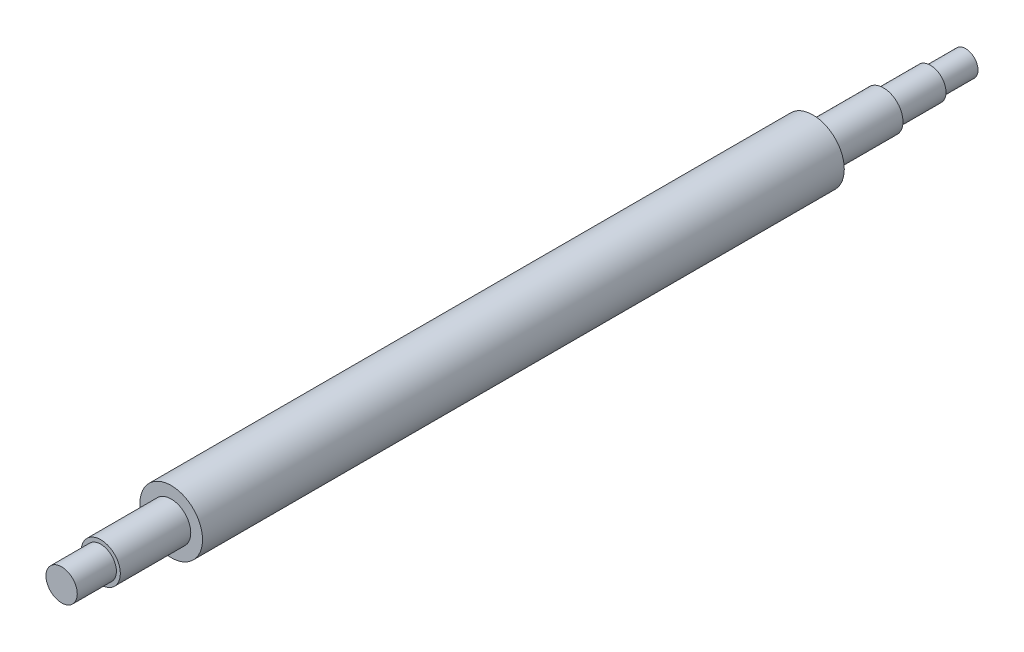
ISO-10303-21;
HEADER;
FILE_DESCRIPTION(('STEP AP214'),'2;1');
FILE_NAME('part.step','',(''),(''),'','','');
FILE_SCHEMA(('AUTOMOTIVE_DESIGN { 1 0 10303 214 1 1 1 1 }'));
ENDSEC;
DATA;
#1=APPLICATION_CONTEXT('core data for automotive mechanical design processes');
#2=APPLICATION_PROTOCOL_DEFINITION('international standard','automotive_design',2000,#1);
#3=PRODUCT_CONTEXT('',#1,'mechanical');
#4=PRODUCT('Part','Part','',(#3));
#5=PRODUCT_RELATED_PRODUCT_CATEGORY('part','',(#4));
#6=PRODUCT_DEFINITION_FORMATION('','',#4);
#7=PRODUCT_DEFINITION_CONTEXT('part definition',#1,'design');
#8=PRODUCT_DEFINITION('design','',#6,#7);
#9=PRODUCT_DEFINITION_SHAPE('','',#8);
#10=(LENGTH_UNIT() NAMED_UNIT(*) SI_UNIT(.MILLI.,.METRE.));
#11=(NAMED_UNIT(*) PLANE_ANGLE_UNIT() SI_UNIT($,.RADIAN.));
#12=(NAMED_UNIT(*) SI_UNIT($,.STERADIAN.) SOLID_ANGLE_UNIT());
#13=UNCERTAINTY_MEASURE_WITH_UNIT(LENGTH_MEASURE(1.E-05),#10,'distance_accuracy_value','');
#14=(GEOMETRIC_REPRESENTATION_CONTEXT(3) GLOBAL_UNCERTAINTY_ASSIGNED_CONTEXT((#13)) GLOBAL_UNIT_ASSIGNED_CONTEXT((#10,
#11,#12)) REPRESENTATION_CONTEXT('',''));
#15=CARTESIAN_POINT('',(0.,0.,0.));
#16=DIRECTION('',(0.,0.,1.));
#17=DIRECTION('',(1.,0.,0.));
#18=AXIS2_PLACEMENT_3D('',#15,#16,#17);
#19=CARTESIAN_POINT('',(0.,0.,192.));
#20=DIRECTION('',(0.,0.,-1.));
#21=DIRECTION('',(-1.,0.,0.));
#22=AXIS2_PLACEMENT_3D('',#19,#20,#21);
#23=CYLINDRICAL_SURFACE('',#22,4.);
#24=CARTESIAN_POINT('',(0.,0.,192.));
#25=DIRECTION('',(0.,0.,1.));
#26=DIRECTION('',(1.,0.,0.));
#27=AXIS2_PLACEMENT_3D('',#24,#25,#26);
#28=CIRCLE('',#27,4.);
#29=CARTESIAN_POINT('',(4.,0.,192.));
#30=VERTEX_POINT('',#29);
#31=EDGE_CURVE('E11',#30,#30,#28,.T.);
#32=ORIENTED_EDGE('',*,*,#31,.F.);
#33=EDGE_LOOP('',(#32));
#34=FACE_BOUND('',#33,.T.);
#35=CARTESIAN_POINT('',(0.,0.,182.));
#36=DIRECTION('',(0.,0.,1.));
#37=DIRECTION('',(1.,0.,0.));
#38=AXIS2_PLACEMENT_3D('',#35,#36,#37);
#39=CIRCLE('',#38,4.);
#40=CARTESIAN_POINT('',(4.,0.,182.));
#41=VERTEX_POINT('',#40);
#42=EDGE_CURVE('E45',#41,#41,#39,.T.);
#43=ORIENTED_EDGE('',*,*,#42,.T.);
#44=EDGE_LOOP('',(#43));
#45=FACE_BOUND('',#44,.T.);
#46=ADVANCED_FACE('F42',(#34,#45),#23,.T.);
#47=CARTESIAN_POINT('',(0.,0.,192.));
#48=DIRECTION('',(0.,0.,1.));
#49=DIRECTION('',(1.,0.,0.));
#50=AXIS2_PLACEMENT_3D('',#47,#48,#49);
#51=PLANE('',#50);
#52=ORIENTED_EDGE('',*,*,#31,.T.);
#53=EDGE_LOOP('',(#52));
#54=FACE_BOUND('',#53,.T.);
#55=ADVANCED_FACE('F57',(#54),#51,.T.);
#56=CARTESIAN_POINT('',(0.,0.,182.));
#57=DIRECTION('',(0.,0.,1.));
#58=DIRECTION('',(1.,0.,0.));
#59=AXIS2_PLACEMENT_3D('',#56,#57,#58);
#60=PLANE('',#59);
#61=ORIENTED_EDGE('',*,*,#42,.F.);
#62=EDGE_LOOP('',(#61));
#63=FACE_BOUND('',#62,.T.);
#64=ADVANCED_FACE('F55',(#63),#60,.F.);
#65=CLOSED_SHELL('',(#46,#55,#64));
#66=MANIFOLD_SOLID_BREP('B2',#65);
#67=CARTESIAN_POINT('',(0.,0.,-30.));
#68=DIRECTION('',(0.,0.,-1.));
#69=DIRECTION('',(-1.,0.,0.));
#70=AXIS2_PLACEMENT_3D('',#67,#68,#69);
#71=PLANE('',#70);
#72=CARTESIAN_POINT('',(0.,0.,-30.));
#73=DIRECTION('',(0.,0.,-1.));
#74=DIRECTION('',(-1.,0.,0.));
#75=AXIS2_PLACEMENT_3D('',#72,#73,#74);
#76=CIRCLE('',#75,4.);
#77=CARTESIAN_POINT('',(-4.,0.,-30.));
#78=VERTEX_POINT('',#77);
#79=EDGE_CURVE('E102',#78,#78,#76,.T.);
#80=ORIENTED_EDGE('',*,*,#79,.T.);
#81=EDGE_LOOP('',(#80));
#82=FACE_BOUND('',#81,.T.);
#83=CARTESIAN_POINT('',(0.,0.,-30.));
#84=DIRECTION('',(0.,0.,-1.));
#85=DIRECTION('',(-1.,0.,0.));
#86=AXIS2_PLACEMENT_3D('',#83,#84,#85);
#87=CIRCLE('',#86,3.175);
#88=CARTESIAN_POINT('',(-3.175,0.,-30.));
#89=VERTEX_POINT('',#88);
#90=EDGE_CURVE('E110',#89,#89,#87,.T.);
#91=ORIENTED_EDGE('',*,*,#90,.F.);
#92=EDGE_LOOP('',(#91));
#93=FACE_BOUND('',#92,.T.);
#94=ADVANCED_FACE('F91',(#82,#93),#71,.T.);
#95=CARTESIAN_POINT('',(0.,0.,-18.));
#96=DIRECTION('',(0.,0.,-1.));
#97=DIRECTION('',(-1.,0.,0.));
#98=AXIS2_PLACEMENT_3D('',#95,#96,#97);
#99=PLANE('',#98);
#100=CARTESIAN_POINT('',(0.,0.,-18.));
#101=DIRECTION('',(0.,0.,-1.));
#102=DIRECTION('',(-1.,0.,0.));
#103=AXIS2_PLACEMENT_3D('',#100,#101,#102);
#104=CIRCLE('',#103,5.);
#105=CARTESIAN_POINT('',(-5.,0.,-18.));
#106=VERTEX_POINT('',#105);
#107=EDGE_CURVE('E41',#106,#106,#104,.T.);
#108=ORIENTED_EDGE('',*,*,#107,.T.);
#109=EDGE_LOOP('',(#108));
#110=FACE_BOUND('',#109,.T.);
#111=CARTESIAN_POINT('',(0.,0.,-18.));
#112=DIRECTION('',(0.,0.,-1.));
#113=DIRECTION('',(-1.,0.,0.));
#114=AXIS2_PLACEMENT_3D('',#111,#112,#113);
#115=CIRCLE('',#114,4.);
#116=CARTESIAN_POINT('',(-4.,0.,-18.));
#117=VERTEX_POINT('',#116);
#118=EDGE_CURVE('E104',#117,#117,#115,.T.);
#119=ORIENTED_EDGE('',*,*,#118,.F.);
#120=EDGE_LOOP('',(#119));
#121=FACE_BOUND('',#120,.T.);
#122=ADVANCED_FACE('F126',(#110,#121),#99,.T.);
#123=CARTESIAN_POINT('',(0.,0.,-18.));
#124=DIRECTION('',(0.,0.,1.));
#125=DIRECTION('',(1.,0.,0.));
#126=AXIS2_PLACEMENT_3D('',#123,#124,#125);
#127=CYLINDRICAL_SURFACE('',#126,5.);
#128=ORIENTED_EDGE('',*,*,#107,.F.);
#129=EDGE_LOOP('',(#128));
#130=FACE_BOUND('',#129,.T.);
#131=CARTESIAN_POINT('',(0.,0.,0.));
#132=DIRECTION('',(0.,0.,-1.));
#133=DIRECTION('',(-1.,0.,0.));
#134=AXIS2_PLACEMENT_3D('',#131,#132,#133);
#135=CIRCLE('',#134,5.);
#136=CARTESIAN_POINT('',(-5.,0.,0.));
#137=VERTEX_POINT('',#136);
#138=EDGE_CURVE('E95',#137,#137,#135,.T.);
#139=ORIENTED_EDGE('',*,*,#138,.T.);
#140=EDGE_LOOP('',(#139));
#141=FACE_BOUND('',#140,.T.);
#142=ADVANCED_FACE('F93',(#130,#141),#127,.T.);
#143=CARTESIAN_POINT('',(0.,0.,0.));
#144=DIRECTION('',(0.,0.,-1.));
#145=DIRECTION('',(-1.,0.,0.));
#146=AXIS2_PLACEMENT_3D('',#143,#144,#145);
#147=PLANE('',#146);
#148=ORIENTED_EDGE('',*,*,#138,.F.);
#149=EDGE_LOOP('',(#148));
#150=FACE_BOUND('',#149,.T.);
#151=ADVANCED_FACE('F136',(#150),#147,.F.);
#152=CARTESIAN_POINT('',(0.,0.,-30.));
#153=DIRECTION('',(0.,0.,1.));
#154=DIRECTION('',(1.,0.,0.));
#155=AXIS2_PLACEMENT_3D('',#152,#153,#154);
#156=CYLINDRICAL_SURFACE('',#155,4.);
#157=ORIENTED_EDGE('',*,*,#79,.F.);
#158=EDGE_LOOP('',(#157));
#159=FACE_BOUND('',#158,.T.);
#160=ORIENTED_EDGE('',*,*,#118,.T.);
#161=EDGE_LOOP('',(#160));
#162=FACE_BOUND('',#161,.T.);
#163=ADVANCED_FACE('F121',(#159,#162),#156,.T.);
#164=CARTESIAN_POINT('',(0.,0.,-39.));
#165=DIRECTION('',(0.,0.,1.));
#166=DIRECTION('',(1.,0.,0.));
#167=AXIS2_PLACEMENT_3D('',#164,#165,#166);
#168=CYLINDRICAL_SURFACE('',#167,3.175);
#169=CARTESIAN_POINT('',(0.,0.,-39.));
#170=DIRECTION('',(0.,0.,-1.));
#171=DIRECTION('',(-1.,0.,0.));
#172=AXIS2_PLACEMENT_3D('',#169,#170,#171);
#173=CIRCLE('',#172,3.175);
#174=CARTESIAN_POINT('',(-3.175,0.,-39.));
#175=VERTEX_POINT('',#174);
#176=EDGE_CURVE('E107',#175,#175,#173,.T.);
#177=ORIENTED_EDGE('',*,*,#176,.F.);
#178=EDGE_LOOP('',(#177));
#179=FACE_BOUND('',#178,.T.);
#180=ORIENTED_EDGE('',*,*,#90,.T.);
#181=EDGE_LOOP('',(#180));
#182=FACE_BOUND('',#181,.T.);
#183=ADVANCED_FACE('F118',(#179,#182),#168,.T.);
#184=CARTESIAN_POINT('',(0.,0.,-39.));
#185=DIRECTION('',(0.,0.,-1.));
#186=DIRECTION('',(-1.,0.,0.));
#187=AXIS2_PLACEMENT_3D('',#184,#185,#186);
#188=PLANE('',#187);
#189=ORIENTED_EDGE('',*,*,#176,.T.);
#190=EDGE_LOOP('',(#189));
#191=FACE_BOUND('',#190,.T.);
#192=ADVANCED_FACE('F116',(#191),#188,.T.);
#193=CLOSED_SHELL('',(#94,#122,#142,#151,#163,#183,#192));
#194=MANIFOLD_SOLID_BREP('B6',#193);
#195=CARTESIAN_POINT('',(0.,0.,182.));
#196=DIRECTION('',(0.,0.,-1.));
#197=DIRECTION('',(-1.,0.,0.));
#198=AXIS2_PLACEMENT_3D('',#195,#196,#197);
#199=CYLINDRICAL_SURFACE('',#198,5.);
#200=CARTESIAN_POINT('',(0.,0.,182.));
#201=DIRECTION('',(0.,0.,1.));
#202=DIRECTION('',(1.,0.,0.));
#203=AXIS2_PLACEMENT_3D('',#200,#201,#202);
#204=CIRCLE('',#203,5.);
#205=CARTESIAN_POINT('',(5.,0.,182.));
#206=VERTEX_POINT('',#205);
#207=EDGE_CURVE('E90',#206,#206,#204,.T.);
#208=ORIENTED_EDGE('',*,*,#207,.F.);
#209=EDGE_LOOP('',(#208));
#210=FACE_BOUND('',#209,.T.);
#211=CARTESIAN_POINT('',(0.,0.,164.));
#212=DIRECTION('',(0.,0.,1.));
#213=DIRECTION('',(1.,0.,0.));
#214=AXIS2_PLACEMENT_3D('',#211,#212,#213);
#215=CIRCLE('',#214,5.);
#216=CARTESIAN_POINT('',(5.,0.,164.));
#217=VERTEX_POINT('',#216);
#218=EDGE_CURVE('E202',#217,#217,#215,.T.);
#219=ORIENTED_EDGE('',*,*,#218,.T.);
#220=EDGE_LOOP('',(#219));
#221=FACE_BOUND('',#220,.T.);
#222=ADVANCED_FACE('F199',(#210,#221),#199,.T.);
#223=CARTESIAN_POINT('',(0.,0.,182.));
#224=DIRECTION('',(0.,0.,1.));
#225=DIRECTION('',(1.,0.,0.));
#226=AXIS2_PLACEMENT_3D('',#223,#224,#225);
#227=PLANE('',#226);
#228=ORIENTED_EDGE('',*,*,#207,.T.);
#229=EDGE_LOOP('',(#228));
#230=FACE_BOUND('',#229,.T.);
#231=ADVANCED_FACE('F214',(#230),#227,.T.);
#232=CARTESIAN_POINT('',(0.,0.,164.));
#233=DIRECTION('',(0.,0.,1.));
#234=DIRECTION('',(1.,0.,0.));
#235=AXIS2_PLACEMENT_3D('',#232,#233,#234);
#236=PLANE('',#235);
#237=ORIENTED_EDGE('',*,*,#218,.F.);
#238=EDGE_LOOP('',(#237));
#239=FACE_BOUND('',#238,.T.);
#240=ADVANCED_FACE('F212',(#239),#236,.F.);
#241=CLOSED_SHELL('',(#222,#231,#240));
#242=MANIFOLD_SOLID_BREP('B36',#241);
#243=CARTESIAN_POINT('',(0.,0.,164.));
#244=DIRECTION('',(0.,0.,-1.));
#245=DIRECTION('',(-1.,0.,0.));
#246=AXIS2_PLACEMENT_3D('',#243,#244,#245);
#247=CYLINDRICAL_SURFACE('',#246,8.);
#248=CARTESIAN_POINT('',(0.,0.,164.));
#249=DIRECTION('',(0.,0.,1.));
#250=DIRECTION('',(1.,0.,0.));
#251=AXIS2_PLACEMENT_3D('',#248,#249,#250);
#252=CIRCLE('',#251,8.);
#253=CARTESIAN_POINT('',(8.,0.,164.));
#254=VERTEX_POINT('',#253);
#255=EDGE_CURVE('E198',#254,#254,#252,.T.);
#256=ORIENTED_EDGE('',*,*,#255,.F.);
#257=EDGE_LOOP('',(#256));
#258=FACE_BOUND('',#257,.T.);
#259=CARTESIAN_POINT('',(0.,0.,0.));
#260=DIRECTION('',(0.,0.,1.));
#261=DIRECTION('',(1.,0.,0.));
#262=AXIS2_PLACEMENT_3D('',#259,#260,#261);
#263=CIRCLE('',#262,8.);
#264=CARTESIAN_POINT('',(8.,0.,0.));
#265=VERTEX_POINT('',#264);
#266=EDGE_CURVE('E243',#265,#265,#263,.T.);
#267=ORIENTED_EDGE('',*,*,#266,.T.);
#268=EDGE_LOOP('',(#267));
#269=FACE_BOUND('',#268,.T.);
#270=ADVANCED_FACE('F240',(#258,#269),#247,.T.);
#271=CARTESIAN_POINT('',(0.,0.,164.));
#272=DIRECTION('',(0.,0.,1.));
#273=DIRECTION('',(1.,0.,0.));
#274=AXIS2_PLACEMENT_3D('',#271,#272,#273);
#275=PLANE('',#274);
#276=ORIENTED_EDGE('',*,*,#255,.T.);
#277=EDGE_LOOP('',(#276));
#278=FACE_BOUND('',#277,.T.);
#279=ADVANCED_FACE('F255',(#278),#275,.T.);
#280=CARTESIAN_POINT('',(0.,0.,0.));
#281=DIRECTION('',(0.,0.,1.));
#282=DIRECTION('',(1.,0.,0.));
#283=AXIS2_PLACEMENT_3D('',#280,#281,#282);
#284=PLANE('',#283);
#285=ORIENTED_EDGE('',*,*,#266,.F.);
#286=EDGE_LOOP('',(#285));
#287=FACE_BOUND('',#286,.T.);
#288=ADVANCED_FACE('F253',(#287),#284,.F.);
#289=CLOSED_SHELL('',(#270,#279,#288));
#290=MANIFOLD_SOLID_BREP('B85',#289);
#291=ADVANCED_BREP_SHAPE_REPRESENTATION('',(#18,#66,#194,#242,#290),#14);
#292=SHAPE_DEFINITION_REPRESENTATION(#9,#291);
ENDSEC;
END-ISO-10303-21;
